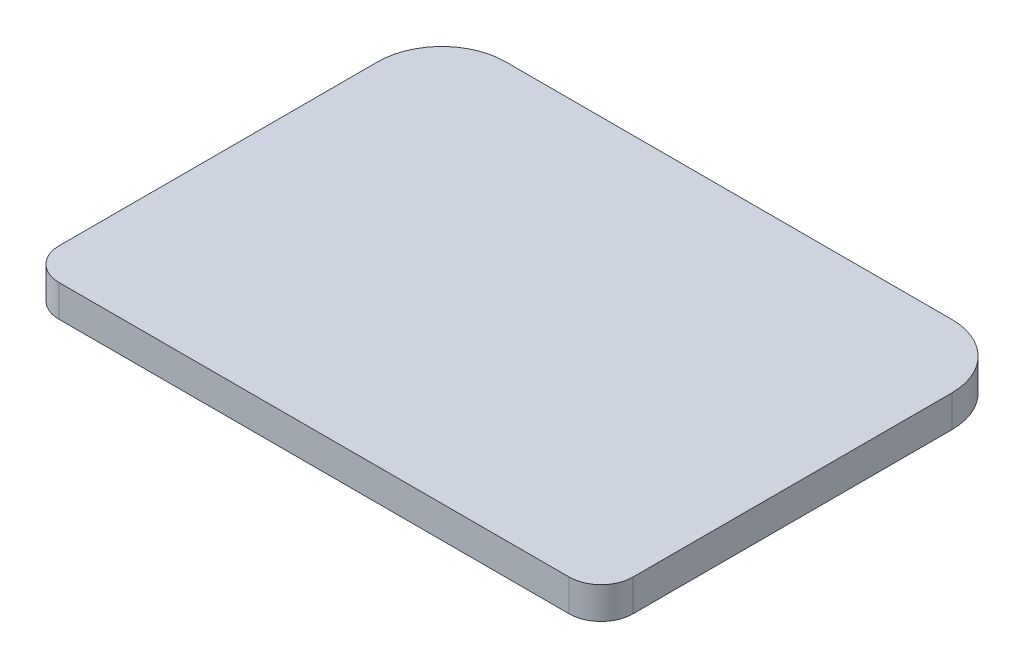
ISO-10303-21;
HEADER;
FILE_DESCRIPTION(('STEP AP214'),'2;1');
FILE_NAME('part.step','',(''),(''),'','','');
FILE_SCHEMA(('AUTOMOTIVE_DESIGN { 1 0 10303 214 1 1 1 1 }'));
ENDSEC;
DATA;
#1=APPLICATION_CONTEXT('core data for automotive mechanical design processes');
#2=APPLICATION_PROTOCOL_DEFINITION('international standard','automotive_design',2000,#1);
#3=PRODUCT_CONTEXT('',#1,'mechanical');
#4=PRODUCT('Part','Part','',(#3));
#5=PRODUCT_RELATED_PRODUCT_CATEGORY('part','',(#4));
#6=PRODUCT_DEFINITION_FORMATION('','',#4);
#7=PRODUCT_DEFINITION_CONTEXT('part definition',#1,'design');
#8=PRODUCT_DEFINITION('design','',#6,#7);
#9=PRODUCT_DEFINITION_SHAPE('','',#8);
#10=(LENGTH_UNIT() NAMED_UNIT(*) SI_UNIT(.MILLI.,.METRE.));
#11=(NAMED_UNIT(*) PLANE_ANGLE_UNIT() SI_UNIT($,.RADIAN.));
#12=(NAMED_UNIT(*) SI_UNIT($,.STERADIAN.) SOLID_ANGLE_UNIT());
#13=UNCERTAINTY_MEASURE_WITH_UNIT(LENGTH_MEASURE(1.E-05),#10,'distance_accuracy_value','');
#14=(GEOMETRIC_REPRESENTATION_CONTEXT(3) GLOBAL_UNCERTAINTY_ASSIGNED_CONTEXT((#13)) GLOBAL_UNIT_ASSIGNED_CONTEXT((#10,
#11,#12)) REPRESENTATION_CONTEXT('',''));
#15=CARTESIAN_POINT('',(0.,0.,0.));
#16=DIRECTION('',(0.,0.,1.));
#17=DIRECTION('',(1.,0.,0.));
#18=AXIS2_PLACEMENT_3D('',#15,#16,#17);
#19=CARTESIAN_POINT('',(28.575,3.175,20.6375));
#20=DIRECTION('',(-1.,0.,0.));
#21=DIRECTION('',(0.,0.,-1.));
#22=AXIS2_PLACEMENT_3D('',#19,#20,#21);
#23=PLANE('',#22);
#24=DIRECTION('',(0.,0.,1.));
#25=VECTOR('',#24,1.);
#26=CARTESIAN_POINT('',(28.575,0.,20.6375));
#27=LINE('',#26,#25);
#28=CARTESIAN_POINT('',(28.575,0.,-14.2875));
#29=VERTEX_POINT('',#28);
#30=CARTESIAN_POINT('',(28.575,0.,17.4625));
#31=VERTEX_POINT('',#30);
#32=EDGE_CURVE('E122',#29,#31,#27,.T.);
#33=ORIENTED_EDGE('',*,*,#32,.F.);
#34=DIRECTION('',(0.,-1.,0.));
#35=VECTOR('',#34,1.);
#36=CARTESIAN_POINT('',(28.575,3.175,-14.2875));
#37=LINE('',#36,#35);
#38=CARTESIAN_POINT('',(28.575,3.175,-14.2875));
#39=VERTEX_POINT('',#38);
#40=EDGE_CURVE('E132',#39,#29,#37,.T.);
#41=ORIENTED_EDGE('',*,*,#40,.F.);
#42=DIRECTION('',(0.,0.,1.));
#43=VECTOR('',#42,1.);
#44=CARTESIAN_POINT('',(28.575,3.175,20.6375));
#45=LINE('',#44,#43);
#46=CARTESIAN_POINT('',(28.575,3.175,17.4625));
#47=VERTEX_POINT('',#46);
#48=EDGE_CURVE('E155',#39,#47,#45,.T.);
#49=ORIENTED_EDGE('',*,*,#48,.T.);
#50=DIRECTION('',(0.,-1.,0.));
#51=VECTOR('',#50,1.);
#52=CARTESIAN_POINT('',(28.575,3.175,17.4625));
#53=LINE('',#52,#51);
#54=EDGE_CURVE('E140',#31,#47,#53,.F.);
#55=ORIENTED_EDGE('',*,*,#54,.F.);
#56=EDGE_LOOP('',(#33,#41,#49,#55));
#57=FACE_BOUND('',#56,.T.);
#58=ADVANCED_FACE('F47',(#57),#23,.F.);
#59=CARTESIAN_POINT('',(-28.575,3.175,20.6375));
#60=DIRECTION('',(0.,0.,-1.));
#61=DIRECTION('',(1.,0.,0.));
#62=AXIS2_PLACEMENT_3D('',#59,#60,#61);
#63=PLANE('',#62);
#64=DIRECTION('',(-1.,0.,0.));
#65=VECTOR('',#64,1.);
#66=CARTESIAN_POINT('',(-28.575,3.175,20.6375));
#67=LINE('',#66,#65);
#68=CARTESIAN_POINT('',(25.4,3.175,20.6375));
#69=VERTEX_POINT('',#68);
#70=CARTESIAN_POINT('',(-25.4,3.175,20.6375));
#71=VERTEX_POINT('',#70);
#72=EDGE_CURVE('E192',#69,#71,#67,.T.);
#73=ORIENTED_EDGE('',*,*,#72,.T.);
#74=DIRECTION('',(0.,-1.,0.));
#75=VECTOR('',#74,1.);
#76=CARTESIAN_POINT('',(-25.4,3.175,20.6375));
#77=LINE('',#76,#75);
#78=CARTESIAN_POINT('',(-25.4,0.,20.6375));
#79=VERTEX_POINT('',#78);
#80=EDGE_CURVE('E170',#79,#71,#77,.F.);
#81=ORIENTED_EDGE('',*,*,#80,.F.);
#82=DIRECTION('',(-1.,0.,0.));
#83=VECTOR('',#82,1.);
#84=CARTESIAN_POINT('',(-28.575,0.,20.6375));
#85=LINE('',#84,#83);
#86=CARTESIAN_POINT('',(25.4,0.,20.6375));
#87=VERTEX_POINT('',#86);
#88=EDGE_CURVE('E142',#87,#79,#85,.T.);
#89=ORIENTED_EDGE('',*,*,#88,.F.);
#90=DIRECTION('',(0.,-1.,0.));
#91=VECTOR('',#90,1.);
#92=CARTESIAN_POINT('',(25.4,3.175,20.6375));
#93=LINE('',#92,#91);
#94=EDGE_CURVE('E172',#69,#87,#93,.T.);
#95=ORIENTED_EDGE('',*,*,#94,.F.);
#96=EDGE_LOOP('',(#73,#81,#89,#95));
#97=FACE_BOUND('',#96,.T.);
#98=ADVANCED_FACE('F190',(#97),#63,.F.);
#99=CARTESIAN_POINT('',(-28.575,3.175,20.6375));
#100=DIRECTION('',(1.,0.,0.));
#101=DIRECTION('',(0.,0.,1.));
#102=AXIS2_PLACEMENT_3D('',#99,#100,#101);
#103=PLANE('',#102);
#104=DIRECTION('',(0.,0.,-1.));
#105=VECTOR('',#104,1.);
#106=CARTESIAN_POINT('',(-28.575,3.175,20.6375));
#107=LINE('',#106,#105);
#108=CARTESIAN_POINT('',(-28.575,3.175,17.4625));
#109=VERTEX_POINT('',#108);
#110=CARTESIAN_POINT('',(-28.575,3.175,-14.2875));
#111=VERTEX_POINT('',#110);
#112=EDGE_CURVE('E195',#109,#111,#107,.T.);
#113=ORIENTED_EDGE('',*,*,#112,.T.);
#114=DIRECTION('',(0.,-1.,0.));
#115=VECTOR('',#114,1.);
#116=CARTESIAN_POINT('',(-28.575,3.175,-14.2875));
#117=LINE('',#116,#115);
#118=CARTESIAN_POINT('',(-28.575,0.,-14.2875));
#119=VERTEX_POINT('',#118);
#120=EDGE_CURVE('E167',#119,#111,#117,.F.);
#121=ORIENTED_EDGE('',*,*,#120,.F.);
#122=DIRECTION('',(0.,0.,-1.));
#123=VECTOR('',#122,1.);
#124=CARTESIAN_POINT('',(-28.575,0.,20.6375));
#125=LINE('',#124,#123);
#126=CARTESIAN_POINT('',(-28.575,0.,17.4625));
#127=VERTEX_POINT('',#126);
#128=EDGE_CURVE('E147',#127,#119,#125,.T.);
#129=ORIENTED_EDGE('',*,*,#128,.F.);
#130=DIRECTION('',(0.,-1.,0.));
#131=VECTOR('',#130,1.);
#132=CARTESIAN_POINT('',(-28.575,3.175,17.4625));
#133=LINE('',#132,#131);
#134=EDGE_CURVE('E11',#109,#127,#133,.T.);
#135=ORIENTED_EDGE('',*,*,#134,.F.);
#136=EDGE_LOOP('',(#113,#121,#129,#135));
#137=FACE_BOUND('',#136,.T.);
#138=ADVANCED_FACE('F209',(#137),#103,.F.);
#139=CARTESIAN_POINT('',(-28.575,3.175,-20.6375));
#140=DIRECTION('',(0.,0.,1.));
#141=DIRECTION('',(-1.,0.,0.));
#142=AXIS2_PLACEMENT_3D('',#139,#140,#141);
#143=PLANE('',#142);
#144=DIRECTION('',(1.,0.,0.));
#145=VECTOR('',#144,1.);
#146=CARTESIAN_POINT('',(-28.575,0.,-20.6375));
#147=LINE('',#146,#145);
#148=CARTESIAN_POINT('',(-22.225,0.,-20.6375));
#149=VERTEX_POINT('',#148);
#150=CARTESIAN_POINT('',(22.225,0.,-20.6375));
#151=VERTEX_POINT('',#150);
#152=EDGE_CURVE('E124',#149,#151,#147,.T.);
#153=ORIENTED_EDGE('',*,*,#152,.F.);
#154=DIRECTION('',(0.,-1.,0.));
#155=VECTOR('',#154,1.);
#156=CARTESIAN_POINT('',(-22.225,3.175,-20.6375));
#157=LINE('',#156,#155);
#158=CARTESIAN_POINT('',(-22.225,3.175,-20.6375));
#159=VERTEX_POINT('',#158);
#160=EDGE_CURVE('E128',#159,#149,#157,.T.);
#161=ORIENTED_EDGE('',*,*,#160,.F.);
#162=DIRECTION('',(1.,0.,0.));
#163=VECTOR('',#162,1.);
#164=CARTESIAN_POINT('',(-28.575,3.175,-20.6375));
#165=LINE('',#164,#163);
#166=CARTESIAN_POINT('',(22.225,3.175,-20.6375));
#167=VERTEX_POINT('',#166);
#168=EDGE_CURVE('E137',#159,#167,#165,.T.);
#169=ORIENTED_EDGE('',*,*,#168,.T.);
#170=DIRECTION('',(0.,-1.,0.));
#171=VECTOR('',#170,1.);
#172=CARTESIAN_POINT('',(22.225,3.175,-20.6375));
#173=LINE('',#172,#171);
#174=EDGE_CURVE('E161',#151,#167,#173,.F.);
#175=ORIENTED_EDGE('',*,*,#174,.F.);
#176=EDGE_LOOP('',(#153,#161,#169,#175));
#177=FACE_BOUND('',#176,.T.);
#178=ADVANCED_FACE('F203',(#177),#143,.F.);
#179=CARTESIAN_POINT('',(0.,3.175,0.));
#180=DIRECTION('',(0.,1.,0.));
#181=DIRECTION('',(0.,0.,-1.));
#182=AXIS2_PLACEMENT_3D('',#179,#180,#181);
#183=PLANE('',#182);
#184=ORIENTED_EDGE('',*,*,#48,.F.);
#185=CARTESIAN_POINT('',(22.225,3.175,-14.2875));
#186=DIRECTION('',(0.,-1.,0.));
#187=DIRECTION('',(0.,0.,-1.));
#188=AXIS2_PLACEMENT_3D('',#185,#186,#187);
#189=CIRCLE('',#188,6.35);
#190=EDGE_CURVE('E134',#167,#39,#189,.T.);
#191=ORIENTED_EDGE('',*,*,#190,.F.);
#192=ORIENTED_EDGE('',*,*,#168,.F.);
#193=CARTESIAN_POINT('',(-22.225,3.175,-14.2875));
#194=DIRECTION('',(0.,-1.,0.));
#195=DIRECTION('',(0.,0.,-1.));
#196=AXIS2_PLACEMENT_3D('',#193,#194,#195);
#197=CIRCLE('',#196,6.35);
#198=EDGE_CURVE('E163',#111,#159,#197,.T.);
#199=ORIENTED_EDGE('',*,*,#198,.F.);
#200=ORIENTED_EDGE('',*,*,#112,.F.);
#201=CARTESIAN_POINT('',(-25.4,3.175,17.4625));
#202=DIRECTION('',(0.,-1.,0.));
#203=DIRECTION('',(0.,0.,-1.));
#204=AXIS2_PLACEMENT_3D('',#201,#202,#203);
#205=CIRCLE('',#204,3.175);
#206=EDGE_CURVE('E61',#71,#109,#205,.T.);
#207=ORIENTED_EDGE('',*,*,#206,.F.);
#208=ORIENTED_EDGE('',*,*,#72,.F.);
#209=CARTESIAN_POINT('',(25.4,3.175,17.4625));
#210=DIRECTION('',(0.,-1.,0.));
#211=DIRECTION('',(0.,0.,-1.));
#212=AXIS2_PLACEMENT_3D('',#209,#210,#211);
#213=CIRCLE('',#212,3.175);
#214=EDGE_CURVE('E55',#47,#69,#213,.T.);
#215=ORIENTED_EDGE('',*,*,#214,.F.);
#216=EDGE_LOOP('',(#184,#191,#192,#199,#200,#207,#208,#215));
#217=FACE_BOUND('',#216,.T.);
#218=ADVANCED_FACE('F193',(#217),#183,.T.);
#219=CARTESIAN_POINT('',(0.,0.,0.));
#220=DIRECTION('',(0.,1.,0.));
#221=DIRECTION('',(0.,0.,-1.));
#222=AXIS2_PLACEMENT_3D('',#219,#220,#221);
#223=PLANE('',#222);
#224=ORIENTED_EDGE('',*,*,#88,.T.);
#225=CARTESIAN_POINT('',(-25.4,0.,17.4625));
#226=DIRECTION('',(0.,-1.,0.));
#227=DIRECTION('',(0.,0.,-1.));
#228=AXIS2_PLACEMENT_3D('',#225,#226,#227);
#229=CIRCLE('',#228,3.175);
#230=EDGE_CURVE('E176',#127,#79,#229,.F.);
#231=ORIENTED_EDGE('',*,*,#230,.F.);
#232=ORIENTED_EDGE('',*,*,#128,.T.);
#233=CARTESIAN_POINT('',(-22.225,0.,-14.2875));
#234=DIRECTION('',(0.,-1.,0.));
#235=DIRECTION('',(0.,0.,-1.));
#236=AXIS2_PLACEMENT_3D('',#233,#234,#235);
#237=CIRCLE('',#236,6.35);
#238=EDGE_CURVE('E129',#149,#119,#237,.F.);
#239=ORIENTED_EDGE('',*,*,#238,.F.);
#240=ORIENTED_EDGE('',*,*,#152,.T.);
#241=CARTESIAN_POINT('',(22.225,0.,-14.2875));
#242=DIRECTION('',(0.,-1.,0.));
#243=DIRECTION('',(0.,0.,-1.));
#244=AXIS2_PLACEMENT_3D('',#241,#242,#243);
#245=CIRCLE('',#244,6.35);
#246=EDGE_CURVE('E117',#29,#151,#245,.F.);
#247=ORIENTED_EDGE('',*,*,#246,.F.);
#248=ORIENTED_EDGE('',*,*,#32,.T.);
#249=CARTESIAN_POINT('',(25.4,0.,17.4625));
#250=DIRECTION('',(0.,-1.,0.));
#251=DIRECTION('',(0.,0.,-1.));
#252=AXIS2_PLACEMENT_3D('',#249,#250,#251);
#253=CIRCLE('',#252,3.175);
#254=EDGE_CURVE('E178',#87,#31,#253,.F.);
#255=ORIENTED_EDGE('',*,*,#254,.F.);
#256=EDGE_LOOP('',(#224,#231,#232,#239,#240,#247,#248,#255));
#257=FACE_BOUND('',#256,.T.);
#258=ADVANCED_FACE('F120',(#257),#223,.F.);
#259=CARTESIAN_POINT('',(22.225,3.175,-14.2875));
#260=DIRECTION('',(0.,-1.,0.));
#261=DIRECTION('',(0.,0.,1.));
#262=AXIS2_PLACEMENT_3D('',#259,#260,#261);
#263=CYLINDRICAL_SURFACE('',#262,6.35);
#264=ORIENTED_EDGE('',*,*,#190,.T.);
#265=ORIENTED_EDGE('',*,*,#40,.T.);
#266=ORIENTED_EDGE('',*,*,#246,.T.);
#267=ORIENTED_EDGE('',*,*,#174,.T.);
#268=EDGE_LOOP('',(#264,#265,#266,#267));
#269=FACE_BOUND('',#268,.T.);
#270=ADVANCED_FACE('F133',(#269),#263,.T.);
#271=CARTESIAN_POINT('',(-22.225,3.175,-14.2875));
#272=DIRECTION('',(0.,-1.,0.));
#273=DIRECTION('',(0.,0.,1.));
#274=AXIS2_PLACEMENT_3D('',#271,#272,#273);
#275=CYLINDRICAL_SURFACE('',#274,6.35);
#276=ORIENTED_EDGE('',*,*,#198,.T.);
#277=ORIENTED_EDGE('',*,*,#160,.T.);
#278=ORIENTED_EDGE('',*,*,#238,.T.);
#279=ORIENTED_EDGE('',*,*,#120,.T.);
#280=EDGE_LOOP('',(#276,#277,#278,#279));
#281=FACE_BOUND('',#280,.T.);
#282=ADVANCED_FACE('F206',(#281),#275,.T.);
#283=CARTESIAN_POINT('',(25.4,3.175,17.4625));
#284=DIRECTION('',(0.,-1.,0.));
#285=DIRECTION('',(0.,0.,1.));
#286=AXIS2_PLACEMENT_3D('',#283,#284,#285);
#287=CYLINDRICAL_SURFACE('',#286,3.175);
#288=ORIENTED_EDGE('',*,*,#214,.T.);
#289=ORIENTED_EDGE('',*,*,#94,.T.);
#290=ORIENTED_EDGE('',*,*,#254,.T.);
#291=ORIENTED_EDGE('',*,*,#54,.T.);
#292=EDGE_LOOP('',(#288,#289,#290,#291));
#293=FACE_BOUND('',#292,.T.);
#294=ADVANCED_FACE('F186',(#293),#287,.T.);
#295=CARTESIAN_POINT('',(-25.4,3.175,17.4625));
#296=DIRECTION('',(0.,-1.,0.));
#297=DIRECTION('',(0.,0.,1.));
#298=AXIS2_PLACEMENT_3D('',#295,#296,#297);
#299=CYLINDRICAL_SURFACE('',#298,3.175);
#300=ORIENTED_EDGE('',*,*,#206,.T.);
#301=ORIENTED_EDGE('',*,*,#134,.T.);
#302=ORIENTED_EDGE('',*,*,#230,.T.);
#303=ORIENTED_EDGE('',*,*,#80,.T.);
#304=EDGE_LOOP('',(#300,#301,#302,#303));
#305=FACE_BOUND('',#304,.T.);
#306=ADVANCED_FACE('F49',(#305),#299,.T.);
#307=CLOSED_SHELL('',(#58,#98,#138,#178,#218,#258,#270,#282,#294,#306));
#308=MANIFOLD_SOLID_BREP('B2',#307);
#309=ADVANCED_BREP_SHAPE_REPRESENTATION('',(#18,#308),#14);
#310=SHAPE_DEFINITION_REPRESENTATION(#9,#309);
ENDSEC;
END-ISO-10303-21;
